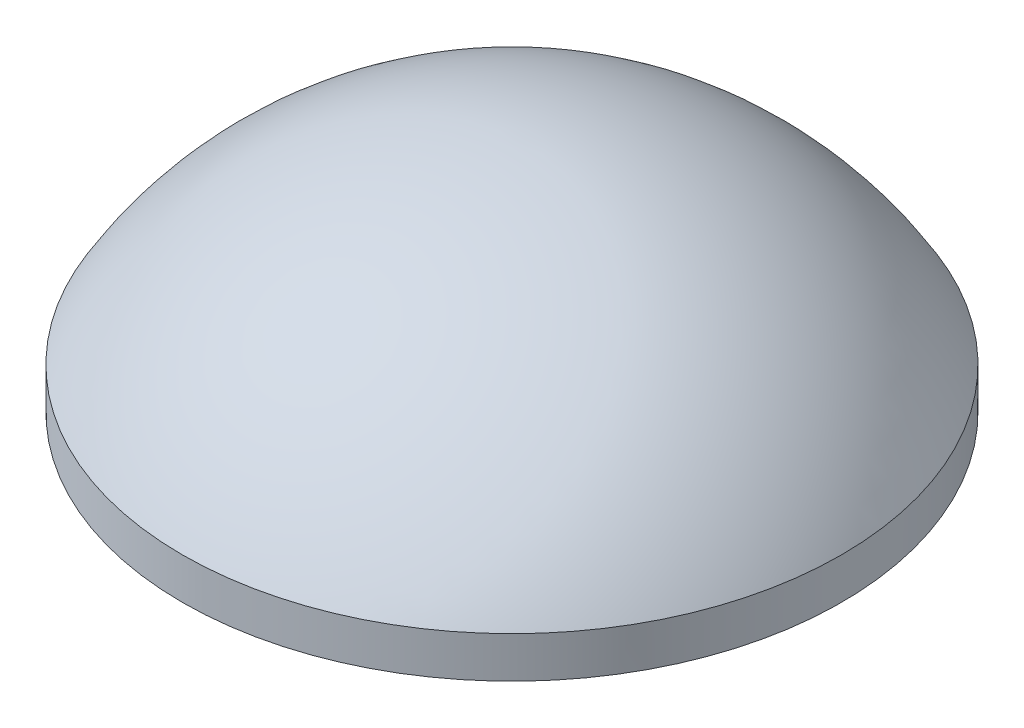
ISO-10303-21;
HEADER;
FILE_DESCRIPTION(('STEP AP214'),'2;1');
FILE_NAME('part.step','',(''),(''),'','','');
FILE_SCHEMA(('AUTOMOTIVE_DESIGN { 1 0 10303 214 1 1 1 1 }'));
ENDSEC;
DATA;
#1=APPLICATION_CONTEXT('core data for automotive mechanical design processes');
#2=APPLICATION_PROTOCOL_DEFINITION('international standard','automotive_design',2000,#1);
#3=PRODUCT_CONTEXT('',#1,'mechanical');
#4=PRODUCT('Part','Part','',(#3));
#5=PRODUCT_RELATED_PRODUCT_CATEGORY('part','',(#4));
#6=PRODUCT_DEFINITION_FORMATION('','',#4);
#7=PRODUCT_DEFINITION_CONTEXT('part definition',#1,'design');
#8=PRODUCT_DEFINITION('design','',#6,#7);
#9=PRODUCT_DEFINITION_SHAPE('','',#8);
#10=(LENGTH_UNIT() NAMED_UNIT(*) SI_UNIT(.MILLI.,.METRE.));
#11=(NAMED_UNIT(*) PLANE_ANGLE_UNIT() SI_UNIT($,.RADIAN.));
#12=(NAMED_UNIT(*) SI_UNIT($,.STERADIAN.) SOLID_ANGLE_UNIT());
#13=UNCERTAINTY_MEASURE_WITH_UNIT(LENGTH_MEASURE(1.E-05),#10,'distance_accuracy_value','');
#14=(GEOMETRIC_REPRESENTATION_CONTEXT(3) GLOBAL_UNCERTAINTY_ASSIGNED_CONTEXT((#13)) GLOBAL_UNIT_ASSIGNED_CONTEXT((#10,
#11,#12)) REPRESENTATION_CONTEXT('',''));
#15=CARTESIAN_POINT('',(0.,0.,0.));
#16=DIRECTION('',(0.,0.,1.));
#17=DIRECTION('',(1.,0.,0.));
#18=AXIS2_PLACEMENT_3D('',#15,#16,#17);
#19=CARTESIAN_POINT('',(0.,66.7243988684583,0.));
#20=DIRECTION('',(0.,1.,0.));
#21=DIRECTION('',(0.,0.,1.));
#22=AXIS2_PLACEMENT_3D('',#19,#20,#21);
#23=CYLINDRICAL_SURFACE('',#22,3.99999999999999);
#24=CARTESIAN_POINT('',(0.,0.,0.));
#25=DIRECTION('',(0.,1.,0.));
#26=DIRECTION('',(0.,0.,1.));
#27=AXIS2_PLACEMENT_3D('',#24,#25,#26);
#28=CIRCLE('',#27,4.);
#29=CARTESIAN_POINT('',(0.,0.,4.));
#30=VERTEX_POINT('',#29);
#31=EDGE_CURVE('E10',#30,#30,#28,.T.);
#32=ORIENTED_EDGE('',*,*,#31,.T.);
#33=EDGE_LOOP('',(#32));
#34=FACE_BOUND('',#33,.T.);
#35=CARTESIAN_POINT('',(0.,0.499999999999987,0.));
#36=DIRECTION('',(0.,1.,0.));
#37=DIRECTION('',(0.,0.,1.));
#38=AXIS2_PLACEMENT_3D('',#35,#36,#37);
#39=CIRCLE('',#38,3.99999999999999);
#40=CARTESIAN_POINT('',(0.,0.499999999999987,3.99999999999999));
#41=VERTEX_POINT('',#40);
#42=EDGE_CURVE('E36',#41,#41,#39,.T.);
#43=ORIENTED_EDGE('',*,*,#42,.F.);
#44=EDGE_LOOP('',(#43));
#45=FACE_BOUND('',#44,.T.);
#46=ADVANCED_FACE('F30',(#34,#45),#23,.T.);
#47=CARTESIAN_POINT('',(-4.,0.,0.));
#48=DIRECTION('',(0.,-1.,0.));
#49=DIRECTION('',(0.,0.,-1.));
#50=AXIS2_PLACEMENT_3D('',#47,#48,#49);
#51=PLANE('',#50);
#52=ORIENTED_EDGE('',*,*,#31,.F.);
#53=EDGE_LOOP('',(#52));
#54=FACE_BOUND('',#53,.T.);
#55=ADVANCED_FACE('F45',(#54),#51,.T.);
#56=CARTESIAN_POINT('',(0.,-1.82826086956515,0.));
#57=DIRECTION('',(0.,1.,0.));
#58=DIRECTION('',(1.,0.,0.));
#59=AXIS2_PLACEMENT_3D('',#56,#57,#58);
#60=SPHERICAL_SURFACE('',#59,4.62826086956517);
#61=ORIENTED_EDGE('',*,*,#42,.T.);
#62=EDGE_LOOP('',(#61));
#63=FACE_BOUND('',#62,.T.);
#64=ADVANCED_FACE('F42',(#63),#60,.T.);
#65=CLOSED_SHELL('',(#46,#55,#64));
#66=MANIFOLD_SOLID_BREP('B2',#65);
#67=ADVANCED_BREP_SHAPE_REPRESENTATION('',(#18,#66),#14);
#68=SHAPE_DEFINITION_REPRESENTATION(#9,#67);
ENDSEC;
END-ISO-10303-21;
